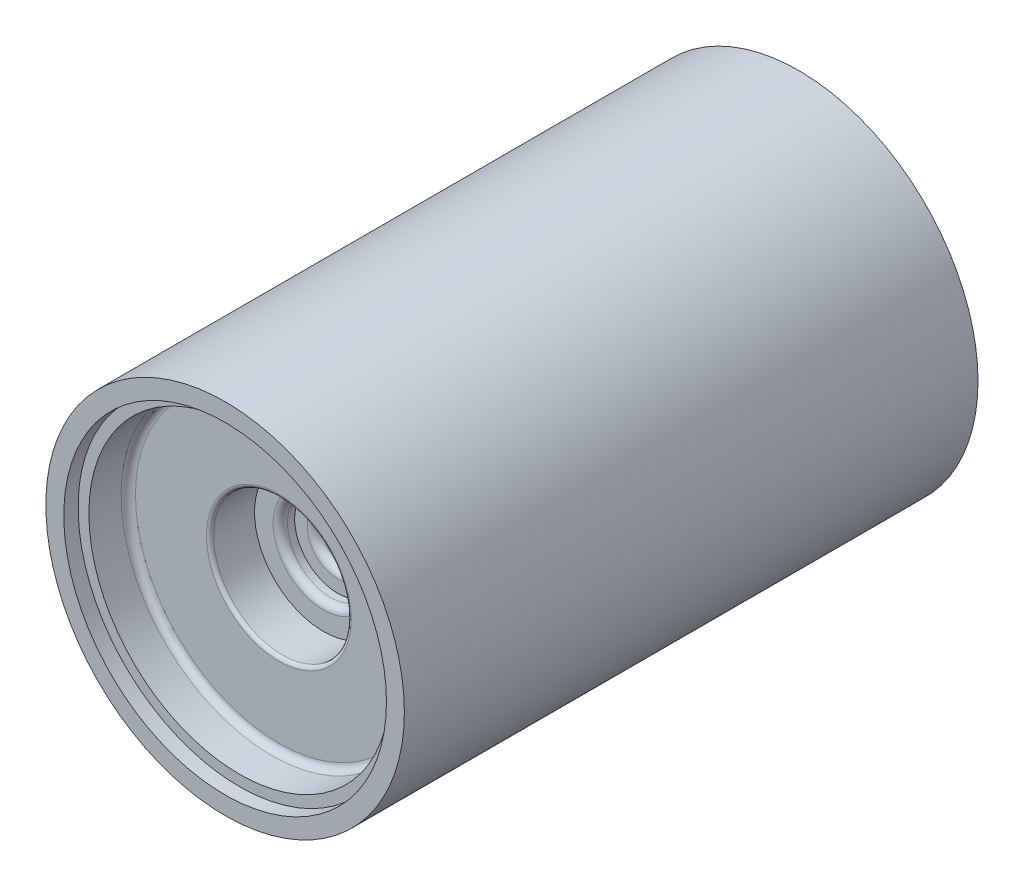
ISO-10303-21;
HEADER;
FILE_DESCRIPTION(('STEP AP214'),'2;1');
FILE_NAME('part.step','',(''),(''),'','','');
FILE_SCHEMA(('AUTOMOTIVE_DESIGN { 1 0 10303 214 1 1 1 1 }'));
ENDSEC;
DATA;
#1=APPLICATION_CONTEXT('core data for automotive mechanical design processes');
#2=APPLICATION_PROTOCOL_DEFINITION('international standard','automotive_design',2000,#1);
#3=PRODUCT_CONTEXT('',#1,'mechanical');
#4=PRODUCT('Part','Part','',(#3));
#5=PRODUCT_RELATED_PRODUCT_CATEGORY('part','',(#4));
#6=PRODUCT_DEFINITION_FORMATION('','',#4);
#7=PRODUCT_DEFINITION_CONTEXT('part definition',#1,'design');
#8=PRODUCT_DEFINITION('design','',#6,#7);
#9=PRODUCT_DEFINITION_SHAPE('','',#8);
#10=(LENGTH_UNIT() NAMED_UNIT(*) SI_UNIT(.MILLI.,.METRE.));
#11=(NAMED_UNIT(*) PLANE_ANGLE_UNIT() SI_UNIT($,.RADIAN.));
#12=(NAMED_UNIT(*) SI_UNIT($,.STERADIAN.) SOLID_ANGLE_UNIT());
#13=UNCERTAINTY_MEASURE_WITH_UNIT(LENGTH_MEASURE(1.E-05),#10,'distance_accuracy_value','');
#14=(GEOMETRIC_REPRESENTATION_CONTEXT(3) GLOBAL_UNCERTAINTY_ASSIGNED_CONTEXT((#13)) GLOBAL_UNIT_ASSIGNED_CONTEXT((#10,
#11,#12)) REPRESENTATION_CONTEXT('',''));
#15=CARTESIAN_POINT('',(0.,0.,0.));
#16=DIRECTION('',(0.,0.,1.));
#17=DIRECTION('',(1.,0.,0.));
#18=AXIS2_PLACEMENT_3D('',#15,#16,#17);
#19=CARTESIAN_POINT('',(0.,0.,40.));
#20=DIRECTION('',(0.,0.,-1.));
#21=DIRECTION('',(-1.,0.,0.));
#22=AXIS2_PLACEMENT_3D('',#19,#20,#21);
#23=CYLINDRICAL_SURFACE('',#22,3.25);
#24=CARTESIAN_POINT('',(0.,0.,-23.3));
#25=DIRECTION('',(0.,0.,-1.));
#26=DIRECTION('',(-1.,0.,0.));
#27=AXIS2_PLACEMENT_3D('',#24,#25,#26);
#28=CIRCLE('',#27,3.25);
#29=CARTESIAN_POINT('',(-3.25,0.,-23.3));
#30=VERTEX_POINT('',#29);
#31=EDGE_CURVE('E67',#30,#30,#28,.T.);
#32=ORIENTED_EDGE('',*,*,#31,.T.);
#33=EDGE_LOOP('',(#32));
#34=FACE_BOUND('',#33,.T.);
#35=CARTESIAN_POINT('',(0.,0.,23.3));
#36=DIRECTION('',(0.,0.,1.));
#37=DIRECTION('',(1.,0.,0.));
#38=AXIS2_PLACEMENT_3D('',#35,#36,#37);
#39=CIRCLE('',#38,3.25);
#40=CARTESIAN_POINT('',(3.25,0.,23.3));
#41=VERTEX_POINT('',#40);
#42=EDGE_CURVE('E70',#41,#41,#39,.T.);
#43=ORIENTED_EDGE('',*,*,#42,.T.);
#44=EDGE_LOOP('',(#43));
#45=FACE_BOUND('',#44,.T.);
#46=ADVANCED_FACE('F41',(#34,#45),#23,.F.);
#47=CARTESIAN_POINT('',(0.,0.,-32.5));
#48=DIRECTION('',(0.,0.,-1.));
#49=DIRECTION('',(-1.,0.,0.));
#50=AXIS2_PLACEMENT_3D('',#47,#48,#49);
#51=CYLINDRICAL_SURFACE('',#50,21.);
#52=CARTESIAN_POINT('',(0.,0.,-33.5));
#53=DIRECTION('',(0.,0.,-1.));
#54=DIRECTION('',(-1.,0.,0.));
#55=AXIS2_PLACEMENT_3D('',#52,#53,#54);
#56=CIRCLE('',#55,21.);
#57=CARTESIAN_POINT('',(-21.,0.,-33.5));
#58=VERTEX_POINT('',#57);
#59=EDGE_CURVE('E73',#58,#58,#56,.F.);
#60=ORIENTED_EDGE('',*,*,#59,.T.);
#61=EDGE_LOOP('',(#60));
#62=FACE_BOUND('',#61,.T.);
#63=CARTESIAN_POINT('',(0.,0.,-38.));
#64=DIRECTION('',(0.,0.,-1.));
#65=DIRECTION('',(-1.,0.,0.));
#66=AXIS2_PLACEMENT_3D('',#63,#64,#65);
#67=CIRCLE('',#66,21.);
#68=CARTESIAN_POINT('',(-21.,0.,-38.));
#69=VERTEX_POINT('',#68);
#70=EDGE_CURVE('E122',#69,#69,#67,.T.);
#71=ORIENTED_EDGE('',*,*,#70,.T.);
#72=EDGE_LOOP('',(#71));
#73=FACE_BOUND('',#72,.T.);
#74=ADVANCED_FACE('F151',(#62,#73),#51,.F.);
#75=CARTESIAN_POINT('',(0.,0.,32.5));
#76=DIRECTION('',(0.,0.,1.));
#77=DIRECTION('',(1.,0.,0.));
#78=AXIS2_PLACEMENT_3D('',#75,#76,#77);
#79=CYLINDRICAL_SURFACE('',#78,21.);
#80=CARTESIAN_POINT('',(0.,0.,33.5));
#81=DIRECTION('',(0.,0.,1.));
#82=DIRECTION('',(1.,0.,0.));
#83=AXIS2_PLACEMENT_3D('',#80,#81,#82);
#84=CIRCLE('',#83,21.);
#85=CARTESIAN_POINT('',(21.,0.,33.5));
#86=VERTEX_POINT('',#85);
#87=EDGE_CURVE('E79',#86,#86,#84,.F.);
#88=ORIENTED_EDGE('',*,*,#87,.T.);
#89=EDGE_LOOP('',(#88));
#90=FACE_BOUND('',#89,.T.);
#91=CARTESIAN_POINT('',(0.,0.,38.));
#92=DIRECTION('',(0.,0.,1.));
#93=DIRECTION('',(1.,0.,0.));
#94=AXIS2_PLACEMENT_3D('',#91,#92,#93);
#95=CIRCLE('',#94,21.);
#96=CARTESIAN_POINT('',(21.,0.,38.));
#97=VERTEX_POINT('',#96);
#98=EDGE_CURVE('E113',#97,#97,#95,.T.);
#99=ORIENTED_EDGE('',*,*,#98,.T.);
#100=EDGE_LOOP('',(#99));
#101=FACE_BOUND('',#100,.T.);
#102=ADVANCED_FACE('F157',(#90,#101),#79,.F.);
#103=CARTESIAN_POINT('',(0.,0.,40.));
#104=DIRECTION('',(0.,0.,1.));
#105=DIRECTION('',(1.,0.,0.));
#106=AXIS2_PLACEMENT_3D('',#103,#104,#105);
#107=PLANE('',#106);
#108=CARTESIAN_POINT('',(0.,0.,40.));
#109=DIRECTION('',(0.,0.,1.));
#110=DIRECTION('',(1.,0.,0.));
#111=AXIS2_PLACEMENT_3D('',#108,#109,#110);
#112=CIRCLE('',#111,22.5);
#113=CARTESIAN_POINT('',(22.5,0.,40.));
#114=VERTEX_POINT('',#113);
#115=EDGE_CURVE('E110',#114,#114,#112,.T.);
#116=ORIENTED_EDGE('',*,*,#115,.F.);
#117=EDGE_LOOP('',(#116));
#118=FACE_BOUND('',#117,.T.);
#119=CARTESIAN_POINT('',(0.,0.,40.));
#120=DIRECTION('',(0.,0.,1.));
#121=DIRECTION('',(1.,0.,0.));
#122=AXIS2_PLACEMENT_3D('',#119,#120,#121);
#123=CIRCLE('',#122,25.);
#124=CARTESIAN_POINT('',(25.,0.,40.));
#125=VERTEX_POINT('',#124);
#126=EDGE_CURVE('E97',#125,#125,#123,.T.);
#127=ORIENTED_EDGE('',*,*,#126,.T.);
#128=EDGE_LOOP('',(#127));
#129=FACE_BOUND('',#128,.T.);
#130=ADVANCED_FACE('F163',(#118,#129),#107,.T.);
#131=CARTESIAN_POINT('',(0.,0.,-40.));
#132=DIRECTION('',(0.,0.,1.));
#133=DIRECTION('',(1.,0.,0.));
#134=AXIS2_PLACEMENT_3D('',#131,#132,#133);
#135=PLANE('',#134);
#136=CARTESIAN_POINT('',(0.,0.,-40.));
#137=DIRECTION('',(0.,0.,-1.));
#138=DIRECTION('',(-1.,0.,0.));
#139=AXIS2_PLACEMENT_3D('',#136,#137,#138);
#140=CIRCLE('',#139,22.5);
#141=CARTESIAN_POINT('',(-22.5,0.,-40.));
#142=VERTEX_POINT('',#141);
#143=EDGE_CURVE('E119',#142,#142,#140,.T.);
#144=ORIENTED_EDGE('',*,*,#143,.F.);
#145=EDGE_LOOP('',(#144));
#146=FACE_BOUND('',#145,.T.);
#147=CARTESIAN_POINT('',(0.,0.,-40.));
#148=DIRECTION('',(0.,0.,1.));
#149=DIRECTION('',(1.,0.,0.));
#150=AXIS2_PLACEMENT_3D('',#147,#148,#149);
#151=CIRCLE('',#150,25.);
#152=CARTESIAN_POINT('',(25.,0.,-40.));
#153=VERTEX_POINT('',#152);
#154=EDGE_CURVE('E98',#153,#153,#151,.T.);
#155=ORIENTED_EDGE('',*,*,#154,.F.);
#156=EDGE_LOOP('',(#155));
#157=FACE_BOUND('',#156,.T.);
#158=ADVANCED_FACE('F166',(#146,#157),#135,.F.);
#159=CARTESIAN_POINT('',(0.,0.,40.));
#160=DIRECTION('',(0.,0.,-1.));
#161=DIRECTION('',(-1.,0.,0.));
#162=AXIS2_PLACEMENT_3D('',#159,#160,#161);
#163=CYLINDRICAL_SURFACE('',#162,25.);
#164=ORIENTED_EDGE('',*,*,#126,.F.);
#165=EDGE_LOOP('',(#164));
#166=FACE_BOUND('',#165,.T.);
#167=ORIENTED_EDGE('',*,*,#154,.T.);
#168=EDGE_LOOP('',(#167));
#169=FACE_BOUND('',#168,.T.);
#170=ADVANCED_FACE('F170',(#166,#169),#163,.T.);
#171=CARTESIAN_POINT('',(0.,0.,-32.5));
#172=DIRECTION('',(0.,0.,-1.));
#173=DIRECTION('',(-1.,0.,0.));
#174=AXIS2_PLACEMENT_3D('',#171,#172,#173);
#175=PLANE('',#174);
#176=CARTESIAN_POINT('',(0.,0.,-32.5));
#177=DIRECTION('',(0.,0.,-1.));
#178=DIRECTION('',(-1.,0.,0.));
#179=AXIS2_PLACEMENT_3D('',#176,#177,#178);
#180=CIRCLE('',#179,20.);
#181=CARTESIAN_POINT('',(-20.,0.,-32.5));
#182=VERTEX_POINT('',#181);
#183=EDGE_CURVE('E76',#182,#182,#180,.T.);
#184=ORIENTED_EDGE('',*,*,#183,.T.);
#185=EDGE_LOOP('',(#184));
#186=FACE_BOUND('',#185,.T.);
#187=CARTESIAN_POINT('',(0.,0.,-32.5));
#188=DIRECTION('',(0.,0.,-1.));
#189=DIRECTION('',(-1.,0.,0.));
#190=AXIS2_PLACEMENT_3D('',#187,#188,#189);
#191=CIRCLE('',#190,10.1);
#192=CARTESIAN_POINT('',(-10.1,0.,-32.5));
#193=VERTEX_POINT('',#192);
#194=EDGE_CURVE('E85',#193,#193,#191,.F.);
#195=ORIENTED_EDGE('',*,*,#194,.T.);
#196=EDGE_LOOP('',(#195));
#197=FACE_BOUND('',#196,.T.);
#198=ADVANCED_FACE('F174',(#186,#197),#175,.T.);
#199=CARTESIAN_POINT('',(0.,0.,32.5));
#200=DIRECTION('',(0.,0.,1.));
#201=DIRECTION('',(1.,0.,0.));
#202=AXIS2_PLACEMENT_3D('',#199,#200,#201);
#203=PLANE('',#202);
#204=CARTESIAN_POINT('',(0.,0.,32.5));
#205=DIRECTION('',(0.,0.,1.));
#206=DIRECTION('',(1.,0.,0.));
#207=AXIS2_PLACEMENT_3D('',#204,#205,#206);
#208=CIRCLE('',#207,20.);
#209=CARTESIAN_POINT('',(20.,0.,32.5));
#210=VERTEX_POINT('',#209);
#211=EDGE_CURVE('E82',#210,#210,#208,.T.);
#212=ORIENTED_EDGE('',*,*,#211,.T.);
#213=EDGE_LOOP('',(#212));
#214=FACE_BOUND('',#213,.T.);
#215=CARTESIAN_POINT('',(0.,0.,32.5));
#216=DIRECTION('',(0.,0.,1.));
#217=DIRECTION('',(1.,0.,0.));
#218=AXIS2_PLACEMENT_3D('',#215,#216,#217);
#219=CIRCLE('',#218,10.1);
#220=CARTESIAN_POINT('',(10.1,0.,32.5));
#221=VERTEX_POINT('',#220);
#222=EDGE_CURVE('E91',#221,#221,#219,.F.);
#223=ORIENTED_EDGE('',*,*,#222,.T.);
#224=EDGE_LOOP('',(#223));
#225=FACE_BOUND('',#224,.T.);
#226=ADVANCED_FACE('F247',(#214,#225),#203,.T.);
#227=CARTESIAN_POINT('',(0.,0.,26.3));
#228=DIRECTION('',(0.,0.,1.));
#229=DIRECTION('',(1.,0.,0.));
#230=AXIS2_PLACEMENT_3D('',#227,#228,#229);
#231=CYLINDRICAL_SURFACE('',#230,9.6);
#232=CARTESIAN_POINT('',(0.,0.,32.));
#233=DIRECTION('',(0.,0.,1.));
#234=DIRECTION('',(1.,0.,0.));
#235=AXIS2_PLACEMENT_3D('',#232,#233,#234);
#236=CIRCLE('',#235,9.6);
#237=CARTESIAN_POINT('',(9.6,0.,32.));
#238=VERTEX_POINT('',#237);
#239=EDGE_CURVE('E94',#238,#238,#236,.T.);
#240=CARTESIAN_POINT('',(0.,0.,26.3));
#241=DIRECTION('',(0.,0.,1.));
#242=DIRECTION('',(1.,0.,0.));
#243=AXIS2_PLACEMENT_3D('',#240,#241,#242);
#244=CIRCLE('',#243,9.6);
#245=CARTESIAN_POINT('',(9.6,0.,26.3));
#246=VERTEX_POINT('',#245);
#247=EDGE_CURVE('E101',#246,#246,#244,.T.);
#248=CARTESIAN_POINT('',(9.6,0.,32.));
#249=CARTESIAN_POINT('',(9.6,0.,31.940625));
#250=CARTESIAN_POINT('',(9.6,0.,31.88125));
#251=CARTESIAN_POINT('',(9.6,0.,31.7625));
#252=CARTESIAN_POINT('',(9.6,0.,31.703125));
#253=CARTESIAN_POINT('',(9.6,0.,31.584375));
#254=CARTESIAN_POINT('',(9.6,0.,31.525));
#255=CARTESIAN_POINT('',(9.6,0.,31.40625));
#256=CARTESIAN_POINT('',(9.6,0.,31.346875));
#257=CARTESIAN_POINT('',(9.6,0.,31.228125));
#258=CARTESIAN_POINT('',(9.6,0.,31.16875));
#259=CARTESIAN_POINT('',(9.6,0.,31.05));
#260=CARTESIAN_POINT('',(9.6,0.,30.990625));
#261=CARTESIAN_POINT('',(9.6,0.,30.871875));
#262=CARTESIAN_POINT('',(9.6,0.,30.8125));
#263=CARTESIAN_POINT('',(9.6,0.,30.69375));
#264=CARTESIAN_POINT('',(9.6,0.,30.634375));
#265=CARTESIAN_POINT('',(9.6,0.,30.515625));
#266=CARTESIAN_POINT('',(9.6,0.,30.45625));
#267=CARTESIAN_POINT('',(9.6,0.,30.3375));
#268=CARTESIAN_POINT('',(9.6,0.,30.278125));
#269=CARTESIAN_POINT('',(9.6,0.,30.159375));
#270=CARTESIAN_POINT('',(9.6,0.,30.1));
#271=CARTESIAN_POINT('',(9.6,0.,29.98125));
#272=CARTESIAN_POINT('',(9.6,0.,29.921875));
#273=CARTESIAN_POINT('',(9.6,0.,29.803125));
#274=CARTESIAN_POINT('',(9.6,0.,29.74375));
#275=CARTESIAN_POINT('',(9.6,0.,29.625));
#276=CARTESIAN_POINT('',(9.6,0.,29.565625));
#277=CARTESIAN_POINT('',(9.6,0.,29.446875));
#278=CARTESIAN_POINT('',(9.6,0.,29.3875));
#279=CARTESIAN_POINT('',(9.6,0.,29.26875));
#280=CARTESIAN_POINT('',(9.6,0.,29.209375));
#281=CARTESIAN_POINT('',(9.6,0.,29.090625));
#282=CARTESIAN_POINT('',(9.6,0.,29.03125));
#283=CARTESIAN_POINT('',(9.6,0.,28.9125));
#284=CARTESIAN_POINT('',(9.6,0.,28.853125));
#285=CARTESIAN_POINT('',(9.6,0.,28.734375));
#286=CARTESIAN_POINT('',(9.6,0.,28.675));
#287=CARTESIAN_POINT('',(9.6,0.,28.55625));
#288=CARTESIAN_POINT('',(9.6,0.,28.496875));
#289=CARTESIAN_POINT('',(9.6,0.,28.378125));
#290=CARTESIAN_POINT('',(9.6,0.,28.31875));
#291=CARTESIAN_POINT('',(9.6,0.,28.2));
#292=CARTESIAN_POINT('',(9.6,0.,28.140625));
#293=CARTESIAN_POINT('',(9.6,0.,28.021875));
#294=CARTESIAN_POINT('',(9.6,0.,27.9625));
#295=CARTESIAN_POINT('',(9.6,0.,27.84375));
#296=CARTESIAN_POINT('',(9.6,0.,27.784375));
#297=CARTESIAN_POINT('',(9.6,0.,27.665625));
#298=CARTESIAN_POINT('',(9.6,0.,27.60625));
#299=CARTESIAN_POINT('',(9.6,0.,27.4875));
#300=CARTESIAN_POINT('',(9.6,0.,27.428125));
#301=CARTESIAN_POINT('',(9.6,0.,27.309375));
#302=CARTESIAN_POINT('',(9.6,0.,27.25));
#303=CARTESIAN_POINT('',(9.6,0.,27.13125));
#304=CARTESIAN_POINT('',(9.6,0.,27.071875));
#305=CARTESIAN_POINT('',(9.6,0.,26.953125));
#306=CARTESIAN_POINT('',(9.6,0.,26.89375));
#307=CARTESIAN_POINT('',(9.6,0.,26.775));
#308=CARTESIAN_POINT('',(9.6,0.,26.715625));
#309=CARTESIAN_POINT('',(9.6,0.,26.596875));
#310=CARTESIAN_POINT('',(9.6,0.,26.5375));
#311=CARTESIAN_POINT('',(9.6,0.,26.41875));
#312=CARTESIAN_POINT('',(9.6,0.,26.359375));
#313=CARTESIAN_POINT('',(9.6,0.,26.3));
#314=B_SPLINE_CURVE_WITH_KNOTS('',3,(#248,#249,#250,#251,#252,#253,#254,#255,#256,#257,#258,
#259,#260,#261,#262,#263,#264,#265,#266,#267,#268,#269,#270,#271,#272,#273,#274,#275,#276,#277,
#278,#279,#280,#281,#282,#283,#284,#285,#286,#287,#288,#289,#290,#291,#292,#293,#294,#295,#296,
#297,#298,#299,#300,#301,#302,#303,#304,#305,#306,#307,#308,#309,#310,#311,#312,#313),
.UNSPECIFIED.,.F.,.F.,(4,2,2,2,2,2,2,2,2,2,2,2,2,2,2,2,2,2,2,2,2,2,2,2,2,2,2,2,2,2,2,2,4),(0.,
0.178124999999994,0.356249999999995,0.534374999999997,0.712499999999998,0.890624999999999,
1.06875,1.246875,1.425,1.603125,1.78125,1.959375,2.1375,2.31562499999999,2.49375,2.671875,
2.84999999999999,3.028125,3.20625,3.384375,3.5625,3.740625,3.91875,4.096875,4.275,4.453125,
4.63125,4.80937499999999,4.9875,5.165625,5.34374999999999,5.521875,5.69999999999999),.UNSPECIFIED.);
#315=EDGE_CURVE('BSEAM243',#238,#246,#314,.T.);
#316=ORIENTED_EDGE('',*,*,#239,.T.);
#317=ORIENTED_EDGE('',*,*,#247,.F.);
#318=ORIENTED_EDGE('',*,*,#315,.T.);
#319=ORIENTED_EDGE('',*,*,#315,.F.);
#320=EDGE_LOOP('',(#316,#318,#317,#319));
#321=FACE_BOUND('',#320,.T.);
#322=ADVANCED_FACE('F243',(#321),#231,.F.);
#323=CARTESIAN_POINT('',(0.,0.,26.3));
#324=DIRECTION('',(0.,0.,1.));
#325=DIRECTION('',(1.,0.,0.));
#326=AXIS2_PLACEMENT_3D('',#323,#324,#325);
#327=PLANE('',#326);
#328=CARTESIAN_POINT('',(0.,0.,26.3));
#329=DIRECTION('',(0.,0.,1.));
#330=DIRECTION('',(1.,0.,0.));
#331=AXIS2_PLACEMENT_3D('',#328,#329,#330);
#332=CIRCLE('',#331,7.);
#333=CARTESIAN_POINT('',(7.,0.,26.3));
#334=VERTEX_POINT('',#333);
#335=EDGE_CURVE('E52',#334,#334,#332,.F.);
#336=ORIENTED_EDGE('',*,*,#335,.T.);
#337=EDGE_LOOP('',(#336));
#338=FACE_BOUND('',#337,.T.);
#339=ORIENTED_EDGE('',*,*,#247,.T.);
#340=EDGE_LOOP('',(#339));
#341=FACE_BOUND('',#340,.T.);
#342=ADVANCED_FACE('F239',(#338,#341),#327,.T.);
#343=CARTESIAN_POINT('',(0.,0.,-26.3));
#344=DIRECTION('',(0.,0.,-1.));
#345=DIRECTION('',(-1.,0.,0.));
#346=AXIS2_PLACEMENT_3D('',#343,#344,#345);
#347=CYLINDRICAL_SURFACE('',#346,9.6);
#348=CARTESIAN_POINT('',(0.,0.,-32.));
#349=DIRECTION('',(0.,0.,-1.));
#350=DIRECTION('',(-1.,0.,0.));
#351=AXIS2_PLACEMENT_3D('',#348,#349,#350);
#352=CIRCLE('',#351,9.6);
#353=CARTESIAN_POINT('',(-9.6,0.,-32.));
#354=VERTEX_POINT('',#353);
#355=EDGE_CURVE('E88',#354,#354,#352,.T.);
#356=CARTESIAN_POINT('',(0.,0.,-26.3));
#357=DIRECTION('',(0.,0.,-1.));
#358=DIRECTION('',(-1.,0.,0.));
#359=AXIS2_PLACEMENT_3D('',#356,#357,#358);
#360=CIRCLE('',#359,9.6);
#361=CARTESIAN_POINT('',(-9.6,0.,-26.3));
#362=VERTEX_POINT('',#361);
#363=EDGE_CURVE('E106',#362,#362,#360,.T.);
#364=CARTESIAN_POINT('',(-9.6,0.,-32.));
#365=CARTESIAN_POINT('',(-9.6,0.,-31.940625));
#366=CARTESIAN_POINT('',(-9.6,0.,-31.88125));
#367=CARTESIAN_POINT('',(-9.6,0.,-31.7625));
#368=CARTESIAN_POINT('',(-9.6,0.,-31.703125));
#369=CARTESIAN_POINT('',(-9.6,0.,-31.584375));
#370=CARTESIAN_POINT('',(-9.6,0.,-31.525));
#371=CARTESIAN_POINT('',(-9.6,0.,-31.40625));
#372=CARTESIAN_POINT('',(-9.6,0.,-31.346875));
#373=CARTESIAN_POINT('',(-9.6,0.,-31.228125));
#374=CARTESIAN_POINT('',(-9.6,0.,-31.16875));
#375=CARTESIAN_POINT('',(-9.6,0.,-31.05));
#376=CARTESIAN_POINT('',(-9.6,0.,-30.990625));
#377=CARTESIAN_POINT('',(-9.6,0.,-30.871875));
#378=CARTESIAN_POINT('',(-9.6,0.,-30.8125));
#379=CARTESIAN_POINT('',(-9.6,0.,-30.69375));
#380=CARTESIAN_POINT('',(-9.6,0.,-30.634375));
#381=CARTESIAN_POINT('',(-9.6,0.,-30.515625));
#382=CARTESIAN_POINT('',(-9.6,0.,-30.45625));
#383=CARTESIAN_POINT('',(-9.6,0.,-30.3375));
#384=CARTESIAN_POINT('',(-9.6,0.,-30.278125));
#385=CARTESIAN_POINT('',(-9.6,0.,-30.159375));
#386=CARTESIAN_POINT('',(-9.6,0.,-30.1));
#387=CARTESIAN_POINT('',(-9.6,0.,-29.98125));
#388=CARTESIAN_POINT('',(-9.6,0.,-29.921875));
#389=CARTESIAN_POINT('',(-9.6,0.,-29.803125));
#390=CARTESIAN_POINT('',(-9.6,0.,-29.74375));
#391=CARTESIAN_POINT('',(-9.6,0.,-29.625));
#392=CARTESIAN_POINT('',(-9.6,0.,-29.565625));
#393=CARTESIAN_POINT('',(-9.6,0.,-29.446875));
#394=CARTESIAN_POINT('',(-9.6,0.,-29.3875));
#395=CARTESIAN_POINT('',(-9.6,0.,-29.26875));
#396=CARTESIAN_POINT('',(-9.6,0.,-29.209375));
#397=CARTESIAN_POINT('',(-9.6,0.,-29.090625));
#398=CARTESIAN_POINT('',(-9.6,0.,-29.03125));
#399=CARTESIAN_POINT('',(-9.6,0.,-28.9125));
#400=CARTESIAN_POINT('',(-9.6,0.,-28.853125));
#401=CARTESIAN_POINT('',(-9.6,0.,-28.734375));
#402=CARTESIAN_POINT('',(-9.6,0.,-28.675));
#403=CARTESIAN_POINT('',(-9.6,0.,-28.55625));
#404=CARTESIAN_POINT('',(-9.6,0.,-28.496875));
#405=CARTESIAN_POINT('',(-9.6,0.,-28.378125));
#406=CARTESIAN_POINT('',(-9.6,0.,-28.31875));
#407=CARTESIAN_POINT('',(-9.6,0.,-28.2));
#408=CARTESIAN_POINT('',(-9.6,0.,-28.140625));
#409=CARTESIAN_POINT('',(-9.6,0.,-28.021875));
#410=CARTESIAN_POINT('',(-9.6,0.,-27.9625));
#411=CARTESIAN_POINT('',(-9.6,0.,-27.84375));
#412=CARTESIAN_POINT('',(-9.6,0.,-27.784375));
#413=CARTESIAN_POINT('',(-9.6,0.,-27.665625));
#414=CARTESIAN_POINT('',(-9.6,0.,-27.60625));
#415=CARTESIAN_POINT('',(-9.6,0.,-27.4875));
#416=CARTESIAN_POINT('',(-9.6,0.,-27.428125));
#417=CARTESIAN_POINT('',(-9.6,0.,-27.309375));
#418=CARTESIAN_POINT('',(-9.6,0.,-27.25));
#419=CARTESIAN_POINT('',(-9.6,0.,-27.13125));
#420=CARTESIAN_POINT('',(-9.6,0.,-27.071875));
#421=CARTESIAN_POINT('',(-9.6,0.,-26.953125));
#422=CARTESIAN_POINT('',(-9.6,0.,-26.89375));
#423=CARTESIAN_POINT('',(-9.6,0.,-26.775));
#424=CARTESIAN_POINT('',(-9.6,0.,-26.715625));
#425=CARTESIAN_POINT('',(-9.6,0.,-26.596875));
#426=CARTESIAN_POINT('',(-9.6,0.,-26.5375));
#427=CARTESIAN_POINT('',(-9.6,0.,-26.41875));
#428=CARTESIAN_POINT('',(-9.6,0.,-26.359375));
#429=CARTESIAN_POINT('',(-9.6,0.,-26.3));
#430=B_SPLINE_CURVE_WITH_KNOTS('',3,(#364,#365,#366,#367,#368,#369,#370,#371,#372,#373,#374,
#375,#376,#377,#378,#379,#380,#381,#382,#383,#384,#385,#386,#387,#388,#389,#390,#391,#392,#393,
#394,#395,#396,#397,#398,#399,#400,#401,#402,#403,#404,#405,#406,#407,#408,#409,#410,#411,#412,
#413,#414,#415,#416,#417,#418,#419,#420,#421,#422,#423,#424,#425,#426,#427,#428,#429),
.UNSPECIFIED.,.F.,.F.,(4,2,2,2,2,2,2,2,2,2,2,2,2,2,2,2,2,2,2,2,2,2,2,2,2,2,2,2,2,2,2,2,4),(0.,
0.178124999999994,0.356249999999995,0.534374999999997,0.712499999999998,0.890624999999999,
1.06875,1.246875,1.425,1.603125,1.78125,1.959375,2.1375,2.31562499999999,2.49375,2.671875,
2.84999999999999,3.028125,3.20625,3.384375,3.5625,3.740625,3.91875,4.096875,4.275,4.453125,
4.63125,4.80937499999999,4.9875,5.165625,5.34374999999999,5.521875,5.69999999999999),.UNSPECIFIED.);
#431=EDGE_CURVE('BSEAM236',#354,#362,#430,.T.);
#432=ORIENTED_EDGE('',*,*,#355,.T.);
#433=ORIENTED_EDGE('',*,*,#363,.F.);
#434=ORIENTED_EDGE('',*,*,#431,.T.);
#435=ORIENTED_EDGE('',*,*,#431,.F.);
#436=EDGE_LOOP('',(#432,#434,#433,#435));
#437=FACE_BOUND('',#436,.T.);
#438=ADVANCED_FACE('F236',(#437),#347,.F.);
#439=CARTESIAN_POINT('',(0.,0.,-26.3));
#440=DIRECTION('',(0.,0.,-1.));
#441=DIRECTION('',(-1.,0.,0.));
#442=AXIS2_PLACEMENT_3D('',#439,#440,#441);
#443=PLANE('',#442);
#444=CARTESIAN_POINT('',(0.,0.,-26.3));
#445=DIRECTION('',(0.,0.,-1.));
#446=DIRECTION('',(-1.,0.,0.));
#447=AXIS2_PLACEMENT_3D('',#444,#445,#446);
#448=CIRCLE('',#447,7.);
#449=CARTESIAN_POINT('',(-7.,0.,-26.3));
#450=VERTEX_POINT('',#449);
#451=EDGE_CURVE('E10',#450,#450,#448,.F.);
#452=ORIENTED_EDGE('',*,*,#451,.T.);
#453=EDGE_LOOP('',(#452));
#454=FACE_BOUND('',#453,.T.);
#455=ORIENTED_EDGE('',*,*,#363,.T.);
#456=EDGE_LOOP('',(#455));
#457=FACE_BOUND('',#456,.T.);
#458=ADVANCED_FACE('F180',(#454,#457),#443,.T.);
#459=CARTESIAN_POINT('',(0.,0.,32.));
#460=DIRECTION('',(0.,0.,1.));
#461=DIRECTION('',(1.,0.,0.));
#462=AXIS2_PLACEMENT_3D('',#459,#460,#461);
#463=TOROIDAL_SURFACE('',#462,10.1,0.5);
#464=ORIENTED_EDGE('',*,*,#222,.F.);
#465=EDGE_LOOP('',(#464));
#466=FACE_BOUND('',#465,.T.);
#467=ORIENTED_EDGE('',*,*,#239,.F.);
#468=EDGE_LOOP('',(#467));
#469=FACE_BOUND('',#468,.T.);
#470=ADVANCED_FACE('F176',(#466,#469),#463,.T.);
#471=CARTESIAN_POINT('',(0.,0.,-32.));
#472=DIRECTION('',(0.,0.,-1.));
#473=DIRECTION('',(-1.,0.,0.));
#474=AXIS2_PLACEMENT_3D('',#471,#472,#473);
#475=TOROIDAL_SURFACE('',#474,10.1,0.5);
#476=ORIENTED_EDGE('',*,*,#194,.F.);
#477=EDGE_LOOP('',(#476));
#478=FACE_BOUND('',#477,.T.);
#479=ORIENTED_EDGE('',*,*,#355,.F.);
#480=EDGE_LOOP('',(#479));
#481=FACE_BOUND('',#480,.T.);
#482=ADVANCED_FACE('F179',(#478,#481),#475,.T.);
#483=CARTESIAN_POINT('',(0.,0.,33.5));
#484=DIRECTION('',(0.,0.,1.));
#485=DIRECTION('',(1.,0.,0.));
#486=AXIS2_PLACEMENT_3D('',#483,#484,#485);
#487=TOROIDAL_SURFACE('',#486,20.,1.);
#488=ORIENTED_EDGE('',*,*,#87,.F.);
#489=EDGE_LOOP('',(#488));
#490=FACE_BOUND('',#489,.T.);
#491=ORIENTED_EDGE('',*,*,#211,.F.);
#492=EDGE_LOOP('',(#491));
#493=FACE_BOUND('',#492,.T.);
#494=ADVANCED_FACE('F184',(#490,#493),#487,.F.);
#495=CARTESIAN_POINT('',(0.,0.,-33.5));
#496=DIRECTION('',(0.,0.,-1.));
#497=DIRECTION('',(-1.,0.,0.));
#498=AXIS2_PLACEMENT_3D('',#495,#496,#497);
#499=TOROIDAL_SURFACE('',#498,20.,1.);
#500=ORIENTED_EDGE('',*,*,#59,.F.);
#501=EDGE_LOOP('',(#500));
#502=FACE_BOUND('',#501,.T.);
#503=ORIENTED_EDGE('',*,*,#183,.F.);
#504=EDGE_LOOP('',(#503));
#505=FACE_BOUND('',#504,.T.);
#506=ADVANCED_FACE('F188',(#502,#505),#499,.F.);
#507=CARTESIAN_POINT('',(0.,0.,38.));
#508=DIRECTION('',(0.,0.,1.));
#509=DIRECTION('',(1.,0.,0.));
#510=AXIS2_PLACEMENT_3D('',#507,#508,#509);
#511=CYLINDRICAL_SURFACE('',#510,22.5);
#512=CARTESIAN_POINT('',(0.,0.,38.));
#513=DIRECTION('',(0.,0.,1.));
#514=DIRECTION('',(1.,0.,0.));
#515=AXIS2_PLACEMENT_3D('',#512,#513,#514);
#516=CIRCLE('',#515,22.5);
#517=CARTESIAN_POINT('',(22.5,0.,38.));
#518=VERTEX_POINT('',#517);
#519=EDGE_CURVE('E109',#518,#518,#516,.T.);
#520=ORIENTED_EDGE('',*,*,#519,.F.);
#521=EDGE_LOOP('',(#520));
#522=FACE_BOUND('',#521,.T.);
#523=ORIENTED_EDGE('',*,*,#115,.T.);
#524=EDGE_LOOP('',(#523));
#525=FACE_BOUND('',#524,.T.);
#526=ADVANCED_FACE('F192',(#522,#525),#511,.F.);
#527=CARTESIAN_POINT('',(0.,0.,38.));
#528=DIRECTION('',(0.,0.,1.));
#529=DIRECTION('',(1.,0.,0.));
#530=AXIS2_PLACEMENT_3D('',#527,#528,#529);
#531=PLANE('',#530);
#532=ORIENTED_EDGE('',*,*,#98,.F.);
#533=EDGE_LOOP('',(#532));
#534=FACE_BOUND('',#533,.T.);
#535=ORIENTED_EDGE('',*,*,#519,.T.);
#536=EDGE_LOOP('',(#535));
#537=FACE_BOUND('',#536,.T.);
#538=ADVANCED_FACE('F226',(#534,#537),#531,.T.);
#539=CARTESIAN_POINT('',(0.,0.,-38.));
#540=DIRECTION('',(0.,0.,-1.));
#541=DIRECTION('',(-1.,0.,0.));
#542=AXIS2_PLACEMENT_3D('',#539,#540,#541);
#543=CYLINDRICAL_SURFACE('',#542,22.5);
#544=CARTESIAN_POINT('',(0.,0.,-38.));
#545=DIRECTION('',(0.,0.,-1.));
#546=DIRECTION('',(-1.,0.,0.));
#547=AXIS2_PLACEMENT_3D('',#544,#545,#546);
#548=CIRCLE('',#547,22.5);
#549=CARTESIAN_POINT('',(-22.5,0.,-38.));
#550=VERTEX_POINT('',#549);
#551=EDGE_CURVE('E118',#550,#550,#548,.T.);
#552=ORIENTED_EDGE('',*,*,#551,.F.);
#553=EDGE_LOOP('',(#552));
#554=FACE_BOUND('',#553,.T.);
#555=ORIENTED_EDGE('',*,*,#143,.T.);
#556=EDGE_LOOP('',(#555));
#557=FACE_BOUND('',#556,.T.);
#558=ADVANCED_FACE('F220',(#554,#557),#543,.F.);
#559=CARTESIAN_POINT('',(0.,0.,-38.));
#560=DIRECTION('',(0.,0.,-1.));
#561=DIRECTION('',(-1.,0.,0.));
#562=AXIS2_PLACEMENT_3D('',#559,#560,#561);
#563=PLANE('',#562);
#564=ORIENTED_EDGE('',*,*,#70,.F.);
#565=EDGE_LOOP('',(#564));
#566=FACE_BOUND('',#565,.T.);
#567=ORIENTED_EDGE('',*,*,#551,.T.);
#568=EDGE_LOOP('',(#567));
#569=FACE_BOUND('',#568,.T.);
#570=ADVANCED_FACE('F213',(#566,#569),#563,.T.);
#571=CARTESIAN_POINT('',(0.,0.,24.3));
#572=DIRECTION('',(0.,0.,1.));
#573=DIRECTION('',(1.,0.,0.));
#574=AXIS2_PLACEMENT_3D('',#571,#572,#573);
#575=CYLINDRICAL_SURFACE('',#574,6.);
#576=CARTESIAN_POINT('',(0.,0.,25.3));
#577=DIRECTION('',(0.,0.,1.));
#578=DIRECTION('',(1.,0.,0.));
#579=AXIS2_PLACEMENT_3D('',#576,#577,#578);
#580=CIRCLE('',#579,6.);
#581=CARTESIAN_POINT('',(6.,0.,25.3));
#582=VERTEX_POINT('',#581);
#583=EDGE_CURVE('E56',#582,#582,#580,.T.);
#584=ORIENTED_EDGE('',*,*,#583,.T.);
#585=EDGE_LOOP('',(#584));
#586=FACE_BOUND('',#585,.T.);
#587=CARTESIAN_POINT('',(0.,0.,24.3));
#588=DIRECTION('',(0.,0.,1.));
#589=DIRECTION('',(1.,0.,0.));
#590=AXIS2_PLACEMENT_3D('',#587,#588,#589);
#591=CIRCLE('',#590,6.);
#592=CARTESIAN_POINT('',(6.,0.,24.3));
#593=VERTEX_POINT('',#592);
#594=EDGE_CURVE('E127',#593,#593,#591,.T.);
#595=ORIENTED_EDGE('',*,*,#594,.F.);
#596=EDGE_LOOP('',(#595));
#597=FACE_BOUND('',#596,.T.);
#598=ADVANCED_FACE('F147',(#586,#597),#575,.F.);
#599=CARTESIAN_POINT('',(0.,0.,24.3));
#600=DIRECTION('',(0.,0.,1.));
#601=DIRECTION('',(1.,0.,0.));
#602=AXIS2_PLACEMENT_3D('',#599,#600,#601);
#603=PLANE('',#602);
#604=CARTESIAN_POINT('',(0.,0.,24.3));
#605=DIRECTION('',(0.,0.,1.));
#606=DIRECTION('',(1.,0.,0.));
#607=AXIS2_PLACEMENT_3D('',#604,#605,#606);
#608=CIRCLE('',#607,4.25);
#609=CARTESIAN_POINT('',(4.25,0.,24.3));
#610=VERTEX_POINT('',#609);
#611=EDGE_CURVE('E61',#610,#610,#608,.F.);
#612=ORIENTED_EDGE('',*,*,#611,.T.);
#613=EDGE_LOOP('',(#612));
#614=FACE_BOUND('',#613,.T.);
#615=ORIENTED_EDGE('',*,*,#594,.T.);
#616=EDGE_LOOP('',(#615));
#617=FACE_BOUND('',#616,.T.);
#618=ADVANCED_FACE('F138',(#614,#617),#603,.T.);
#619=CARTESIAN_POINT('',(0.,0.,-24.3));
#620=DIRECTION('',(0.,0.,-1.));
#621=DIRECTION('',(-1.,0.,0.));
#622=AXIS2_PLACEMENT_3D('',#619,#620,#621);
#623=CYLINDRICAL_SURFACE('',#622,6.);
#624=CARTESIAN_POINT('',(0.,0.,-25.3));
#625=DIRECTION('',(0.,0.,-1.));
#626=DIRECTION('',(-1.,0.,0.));
#627=AXIS2_PLACEMENT_3D('',#624,#625,#626);
#628=CIRCLE('',#627,6.);
#629=CARTESIAN_POINT('',(-6.,0.,-25.3));
#630=VERTEX_POINT('',#629);
#631=EDGE_CURVE('E48',#630,#630,#628,.T.);
#632=ORIENTED_EDGE('',*,*,#631,.T.);
#633=EDGE_LOOP('',(#632));
#634=FACE_BOUND('',#633,.T.);
#635=CARTESIAN_POINT('',(0.,0.,-24.3));
#636=DIRECTION('',(0.,0.,-1.));
#637=DIRECTION('',(-1.,0.,0.));
#638=AXIS2_PLACEMENT_3D('',#635,#636,#637);
#639=CIRCLE('',#638,6.);
#640=CARTESIAN_POINT('',(-6.,0.,-24.3));
#641=VERTEX_POINT('',#640);
#642=EDGE_CURVE('E130',#641,#641,#639,.T.);
#643=ORIENTED_EDGE('',*,*,#642,.F.);
#644=EDGE_LOOP('',(#643));
#645=FACE_BOUND('',#644,.T.);
#646=ADVANCED_FACE('F136',(#634,#645),#623,.F.);
#647=CARTESIAN_POINT('',(0.,0.,-24.3));
#648=DIRECTION('',(0.,0.,-1.));
#649=DIRECTION('',(-1.,0.,0.));
#650=AXIS2_PLACEMENT_3D('',#647,#648,#649);
#651=PLANE('',#650);
#652=CARTESIAN_POINT('',(0.,0.,-24.3));
#653=DIRECTION('',(0.,0.,-1.));
#654=DIRECTION('',(-1.,0.,0.));
#655=AXIS2_PLACEMENT_3D('',#652,#653,#654);
#656=CIRCLE('',#655,4.25);
#657=CARTESIAN_POINT('',(-4.25,0.,-24.3));
#658=VERTEX_POINT('',#657);
#659=EDGE_CURVE('E64',#658,#658,#656,.F.);
#660=ORIENTED_EDGE('',*,*,#659,.T.);
#661=EDGE_LOOP('',(#660));
#662=FACE_BOUND('',#661,.T.);
#663=ORIENTED_EDGE('',*,*,#642,.T.);
#664=EDGE_LOOP('',(#663));
#665=FACE_BOUND('',#664,.T.);
#666=ADVANCED_FACE('F134',(#662,#665),#651,.T.);
#667=CARTESIAN_POINT('',(0.,0.,-23.3));
#668=DIRECTION('',(0.,0.,-1.));
#669=DIRECTION('',(-1.,0.,0.));
#670=AXIS2_PLACEMENT_3D('',#667,#668,#669);
#671=TOROIDAL_SURFACE('',#670,4.25,1.);
#672=ORIENTED_EDGE('',*,*,#659,.F.);
#673=EDGE_LOOP('',(#672));
#674=FACE_BOUND('',#673,.T.);
#675=ORIENTED_EDGE('',*,*,#31,.F.);
#676=EDGE_LOOP('',(#675));
#677=FACE_BOUND('',#676,.T.);
#678=ADVANCED_FACE('F144',(#674,#677),#671,.T.);
#679=CARTESIAN_POINT('',(0.,0.,23.3));
#680=DIRECTION('',(0.,0.,1.));
#681=DIRECTION('',(1.,0.,0.));
#682=AXIS2_PLACEMENT_3D('',#679,#680,#681);
#683=TOROIDAL_SURFACE('',#682,4.25,1.);
#684=ORIENTED_EDGE('',*,*,#611,.F.);
#685=EDGE_LOOP('',(#684));
#686=FACE_BOUND('',#685,.T.);
#687=ORIENTED_EDGE('',*,*,#42,.F.);
#688=EDGE_LOOP('',(#687));
#689=FACE_BOUND('',#688,.T.);
#690=ADVANCED_FACE('F196',(#686,#689),#683,.T.);
#691=CARTESIAN_POINT('',(0.,0.,25.3));
#692=DIRECTION('',(0.,0.,1.));
#693=DIRECTION('',(1.,0.,0.));
#694=AXIS2_PLACEMENT_3D('',#691,#692,#693);
#695=TOROIDAL_SURFACE('',#694,7.,1.);
#696=ORIENTED_EDGE('',*,*,#335,.F.);
#697=EDGE_LOOP('',(#696));
#698=FACE_BOUND('',#697,.T.);
#699=ORIENTED_EDGE('',*,*,#583,.F.);
#700=EDGE_LOOP('',(#699));
#701=FACE_BOUND('',#700,.T.);
#702=ADVANCED_FACE('F199',(#698,#701),#695,.T.);
#703=CARTESIAN_POINT('',(0.,0.,-25.3));
#704=DIRECTION('',(0.,0.,-1.));
#705=DIRECTION('',(-1.,0.,0.));
#706=AXIS2_PLACEMENT_3D('',#703,#704,#705);
#707=TOROIDAL_SURFACE('',#706,7.,1.);
#708=ORIENTED_EDGE('',*,*,#451,.F.);
#709=EDGE_LOOP('',(#708));
#710=FACE_BOUND('',#709,.T.);
#711=ORIENTED_EDGE('',*,*,#631,.F.);
#712=EDGE_LOOP('',(#711));
#713=FACE_BOUND('',#712,.T.);
#714=ADVANCED_FACE('F43',(#710,#713),#707,.T.);
#715=CLOSED_SHELL('',(#46,#74,#102,#130,#158,#170,#198,#226,#322,#342,#438,#458,#470,#482,#494,
#506,#526,#538,#558,#570,#598,#618,#646,#666,#678,#690,#702,#714));
#716=MANIFOLD_SOLID_BREP('B2',#715);
#717=ADVANCED_BREP_SHAPE_REPRESENTATION('',(#18,#716),#14);
#718=SHAPE_DEFINITION_REPRESENTATION(#9,#717);
ENDSEC;
END-ISO-10303-21;
